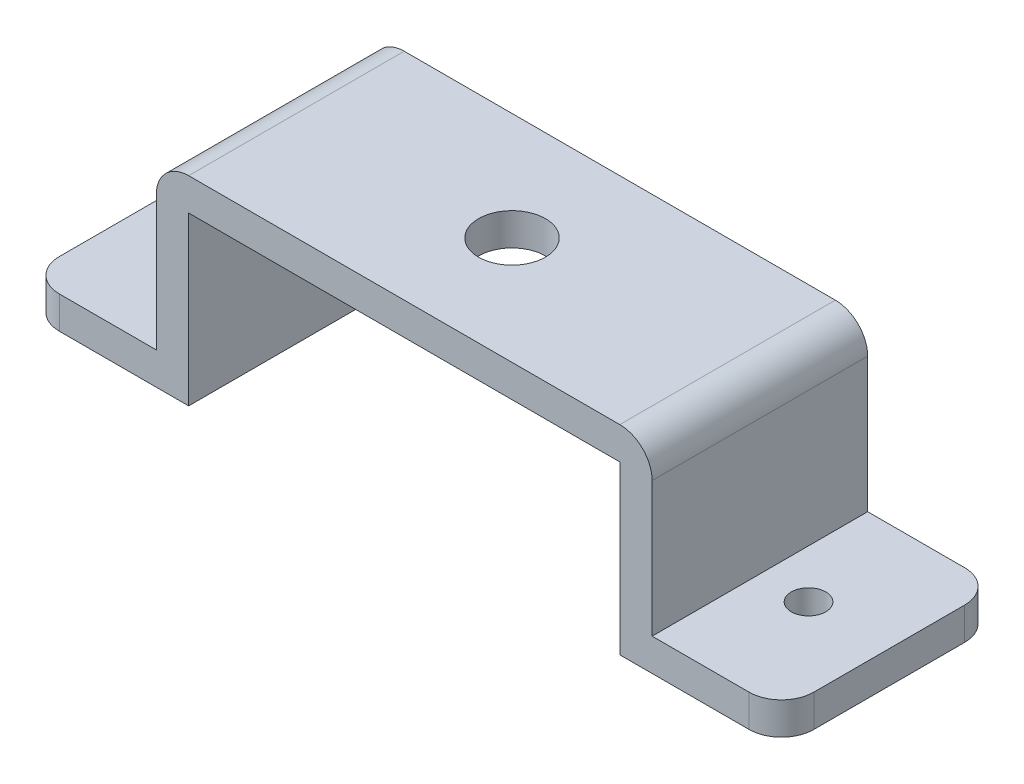
ISO-10303-21;
HEADER;
FILE_DESCRIPTION(('STEP AP214'),'2;1');
FILE_NAME('part.step','',(''),(''),'','','');
FILE_SCHEMA(('AUTOMOTIVE_DESIGN { 1 0 10303 214 1 1 1 1 }'));
ENDSEC;
DATA;
#1=APPLICATION_CONTEXT('core data for automotive mechanical design processes');
#2=APPLICATION_PROTOCOL_DEFINITION('international standard','automotive_design',2000,#1);
#3=PRODUCT_CONTEXT('',#1,'mechanical');
#4=PRODUCT('Part','Part','',(#3));
#5=PRODUCT_RELATED_PRODUCT_CATEGORY('part','',(#4));
#6=PRODUCT_DEFINITION_FORMATION('','',#4);
#7=PRODUCT_DEFINITION_CONTEXT('part definition',#1,'design');
#8=PRODUCT_DEFINITION('design','',#6,#7);
#9=PRODUCT_DEFINITION_SHAPE('','',#8);
#10=(LENGTH_UNIT() NAMED_UNIT(*) SI_UNIT(.MILLI.,.METRE.));
#11=(NAMED_UNIT(*) PLANE_ANGLE_UNIT() SI_UNIT($,.RADIAN.));
#12=(NAMED_UNIT(*) SI_UNIT($,.STERADIAN.) SOLID_ANGLE_UNIT());
#13=UNCERTAINTY_MEASURE_WITH_UNIT(LENGTH_MEASURE(1.E-05),#10,'distance_accuracy_value','');
#14=(GEOMETRIC_REPRESENTATION_CONTEXT(3) GLOBAL_UNCERTAINTY_ASSIGNED_CONTEXT((#13)) GLOBAL_UNIT_ASSIGNED_CONTEXT((#10,
#11,#12)) REPRESENTATION_CONTEXT('',''));
#15=CARTESIAN_POINT('',(0.,0.,0.));
#16=DIRECTION('',(0.,0.,1.));
#17=DIRECTION('',(1.,0.,0.));
#18=AXIS2_PLACEMENT_3D('',#15,#16,#17);
#19=CARTESIAN_POINT('',(0.,15.5,0.));
#20=DIRECTION('',(0.,1.,0.));
#21=DIRECTION('',(0.,0.,1.));
#22=AXIS2_PLACEMENT_3D('',#19,#20,#21);
#23=PLANE('',#22);
#24=CARTESIAN_POINT('',(0.,15.5,0.));
#25=DIRECTION('',(0.,1.,0.));
#26=DIRECTION('',(0.,0.,1.));
#27=AXIS2_PLACEMENT_3D('',#24,#25,#26);
#28=CIRCLE('',#27,3.1);
#29=CARTESIAN_POINT('',(0.,15.5,3.1));
#30=VERTEX_POINT('',#29);
#31=EDGE_CURVE('E455',#30,#30,#28,.T.);
#32=ORIENTED_EDGE('',*,*,#31,.T.);
#33=EDGE_LOOP('',(#32));
#34=FACE_BOUND('',#33,.T.);
#35=DIRECTION('',(0.,0.,1.));
#36=VECTOR('',#35,1.);
#37=CARTESIAN_POINT('',(20.,15.5,10.));
#38=LINE('',#37,#36);
#39=CARTESIAN_POINT('',(20.,15.5,-10.));
#40=VERTEX_POINT('',#39);
#41=CARTESIAN_POINT('',(20.,15.5,10.));
#42=VERTEX_POINT('',#41);
#43=EDGE_CURVE('E169',#40,#42,#38,.T.);
#44=ORIENTED_EDGE('',*,*,#43,.T.);
#45=DIRECTION('',(1.,0.,0.));
#46=VECTOR('',#45,1.);
#47=CARTESIAN_POINT('',(-23.,15.5,10.));
#48=LINE('',#47,#46);
#49=CARTESIAN_POINT('',(-20.,15.5,10.));
#50=VERTEX_POINT('',#49);
#51=EDGE_CURVE('E180',#50,#42,#48,.T.);
#52=ORIENTED_EDGE('',*,*,#51,.F.);
#53=DIRECTION('',(0.,0.,-1.));
#54=VECTOR('',#53,1.);
#55=CARTESIAN_POINT('',(-20.,15.5,-10.));
#56=LINE('',#55,#54);
#57=CARTESIAN_POINT('',(-20.,15.5,-10.));
#58=VERTEX_POINT('',#57);
#59=EDGE_CURVE('E196',#50,#58,#56,.T.);
#60=ORIENTED_EDGE('',*,*,#59,.T.);
#61=DIRECTION('',(-1.,0.,0.));
#62=VECTOR('',#61,1.);
#63=CARTESIAN_POINT('',(-23.,15.5,-10.));
#64=LINE('',#63,#62);
#65=EDGE_CURVE('E186',#40,#58,#64,.T.);
#66=ORIENTED_EDGE('',*,*,#65,.F.);
#67=EDGE_LOOP('',(#44,#52,#60,#66));
#68=FACE_BOUND('',#67,.T.);
#69=ADVANCED_FACE('F45',(#34,#68),#23,.F.);
#70=CARTESIAN_POINT('',(-35.,3.,10.));
#71=DIRECTION('',(1.,0.,0.));
#72=DIRECTION('',(0.,0.,-1.));
#73=AXIS2_PLACEMENT_3D('',#70,#71,#72);
#74=PLANE('',#73);
#75=DIRECTION('',(0.,0.,1.));
#76=VECTOR('',#75,1.);
#77=CARTESIAN_POINT('',(-35.,3.,10.));
#78=LINE('',#77,#76);
#79=CARTESIAN_POINT('',(-35.,3.,-7.));
#80=VERTEX_POINT('',#79);
#81=CARTESIAN_POINT('',(-35.,3.,7.));
#82=VERTEX_POINT('',#81);
#83=EDGE_CURVE('E234',#80,#82,#78,.T.);
#84=ORIENTED_EDGE('',*,*,#83,.F.);
#85=DIRECTION('',(0.,-1.,0.));
#86=VECTOR('',#85,1.);
#87=CARTESIAN_POINT('',(-35.,3.,-7.));
#88=LINE('',#87,#86);
#89=CARTESIAN_POINT('',(-35.,0.,-7.));
#90=VERTEX_POINT('',#89);
#91=EDGE_CURVE('E255',#80,#90,#88,.T.);
#92=ORIENTED_EDGE('',*,*,#91,.T.);
#93=DIRECTION('',(0.,0.,1.));
#94=VECTOR('',#93,1.);
#95=CARTESIAN_POINT('',(-35.,0.,10.));
#96=LINE('',#95,#94);
#97=CARTESIAN_POINT('',(-35.,0.,7.));
#98=VERTEX_POINT('',#97);
#99=EDGE_CURVE('E244',#90,#98,#96,.T.);
#100=ORIENTED_EDGE('',*,*,#99,.T.);
#101=DIRECTION('',(0.,-1.,0.));
#102=VECTOR('',#101,1.);
#103=CARTESIAN_POINT('',(-35.,3.,7.));
#104=LINE('',#103,#102);
#105=EDGE_CURVE('E253',#98,#82,#104,.F.);
#106=ORIENTED_EDGE('',*,*,#105,.T.);
#107=EDGE_LOOP('',(#84,#92,#100,#106));
#108=FACE_BOUND('',#107,.T.);
#109=ADVANCED_FACE('F335',(#108),#74,.F.);
#110=CARTESIAN_POINT('',(-27.4996209045942,24.,-0.0108268287106467));
#111=DIRECTION('',(0.,-1.,0.));
#112=DIRECTION('',(0.,0.,-1.));
#113=AXIS2_PLACEMENT_3D('',#110,#111,#112);
#114=CYLINDRICAL_SURFACE('',#113,1.6);
#115=CARTESIAN_POINT('',(-27.4996209045942,0.,-0.0108268287106467));
#116=DIRECTION('',(0.,-1.,0.));
#117=DIRECTION('',(0.,0.,-1.));
#118=AXIS2_PLACEMENT_3D('',#115,#116,#117);
#119=CIRCLE('',#118,1.6);
#120=CARTESIAN_POINT('',(-27.4996209045942,0.,-1.61082682871064));
#121=VERTEX_POINT('',#120);
#122=EDGE_CURVE('E210',#121,#121,#119,.T.);
#123=ORIENTED_EDGE('',*,*,#122,.T.);
#124=EDGE_LOOP('',(#123));
#125=FACE_BOUND('',#124,.T.);
#126=CARTESIAN_POINT('',(-27.4996209045942,3.,-0.0108268287106467));
#127=DIRECTION('',(0.,-1.,0.));
#128=DIRECTION('',(0.,0.,-1.));
#129=AXIS2_PLACEMENT_3D('',#126,#127,#128);
#130=CIRCLE('',#129,1.6);
#131=CARTESIAN_POINT('',(-27.4996209045942,3.,-1.61082682871064));
#132=VERTEX_POINT('',#131);
#133=EDGE_CURVE('E213',#132,#132,#130,.T.);
#134=ORIENTED_EDGE('',*,*,#133,.F.);
#135=EDGE_LOOP('',(#134));
#136=FACE_BOUND('',#135,.T.);
#137=ADVANCED_FACE('F369',(#125,#136),#114,.F.);
#138=CARTESIAN_POINT('',(-32.,3.,-7.));
#139=DIRECTION('',(0.,-1.,0.));
#140=DIRECTION('',(0.,0.,-1.));
#141=AXIS2_PLACEMENT_3D('',#138,#139,#140);
#142=CYLINDRICAL_SURFACE('',#141,3.);
#143=CARTESIAN_POINT('',(-32.,3.,-7.));
#144=DIRECTION('',(0.,-1.,0.));
#145=DIRECTION('',(0.,0.,-1.));
#146=AXIS2_PLACEMENT_3D('',#143,#144,#145);
#147=CIRCLE('',#146,3.);
#148=CARTESIAN_POINT('',(-32.,3.,-10.));
#149=VERTEX_POINT('',#148);
#150=EDGE_CURVE('E264',#149,#80,#147,.F.);
#151=ORIENTED_EDGE('',*,*,#150,.F.);
#152=DIRECTION('',(0.,-1.,0.));
#153=VECTOR('',#152,1.);
#154=CARTESIAN_POINT('',(-32.,3.,-10.));
#155=LINE('',#154,#153);
#156=CARTESIAN_POINT('',(-32.,0.,-10.));
#157=VERTEX_POINT('',#156);
#158=EDGE_CURVE('E241',#157,#149,#155,.F.);
#159=ORIENTED_EDGE('',*,*,#158,.F.);
#160=CARTESIAN_POINT('',(-32.,0.,-7.));
#161=DIRECTION('',(0.,-1.,0.));
#162=DIRECTION('',(0.,0.,-1.));
#163=AXIS2_PLACEMENT_3D('',#160,#161,#162);
#164=CIRCLE('',#163,3.);
#165=EDGE_CURVE('E260',#90,#157,#164,.T.);
#166=ORIENTED_EDGE('',*,*,#165,.F.);
#167=ORIENTED_EDGE('',*,*,#91,.F.);
#168=EDGE_LOOP('',(#151,#159,#166,#167));
#169=FACE_BOUND('',#168,.T.);
#170=ADVANCED_FACE('F332',(#169),#142,.T.);
#171=CARTESIAN_POINT('',(-32.,3.,7.));
#172=DIRECTION('',(0.,-1.,0.));
#173=DIRECTION('',(0.,0.,-1.));
#174=AXIS2_PLACEMENT_3D('',#171,#172,#173);
#175=CYLINDRICAL_SURFACE('',#174,3.);
#176=CARTESIAN_POINT('',(-32.,3.,7.));
#177=DIRECTION('',(0.,-1.,0.));
#178=DIRECTION('',(0.,0.,-1.));
#179=AXIS2_PLACEMENT_3D('',#176,#177,#178);
#180=CIRCLE('',#179,3.);
#181=CARTESIAN_POINT('',(-32.,3.,10.));
#182=VERTEX_POINT('',#181);
#183=EDGE_CURVE('E262',#82,#182,#180,.F.);
#184=ORIENTED_EDGE('',*,*,#183,.F.);
#185=ORIENTED_EDGE('',*,*,#105,.F.);
#186=CARTESIAN_POINT('',(-32.,0.,7.));
#187=DIRECTION('',(0.,-1.,0.));
#188=DIRECTION('',(0.,0.,-1.));
#189=AXIS2_PLACEMENT_3D('',#186,#187,#188);
#190=CIRCLE('',#189,3.);
#191=CARTESIAN_POINT('',(-32.,0.,10.));
#192=VERTEX_POINT('',#191);
#193=EDGE_CURVE('E258',#192,#98,#190,.T.);
#194=ORIENTED_EDGE('',*,*,#193,.F.);
#195=DIRECTION('',(0.,-1.,0.));
#196=VECTOR('',#195,1.);
#197=CARTESIAN_POINT('',(-32.,3.,10.));
#198=LINE('',#197,#196);
#199=EDGE_CURVE('E250',#182,#192,#198,.T.);
#200=ORIENTED_EDGE('',*,*,#199,.F.);
#201=EDGE_LOOP('',(#184,#185,#194,#200));
#202=FACE_BOUND('',#201,.T.);
#203=ADVANCED_FACE('F344',(#202),#175,.T.);
#204=CARTESIAN_POINT('',(0.,0.,0.));
#205=DIRECTION('',(0.,-1.,0.));
#206=DIRECTION('',(0.,0.,-1.));
#207=AXIS2_PLACEMENT_3D('',#204,#205,#206);
#208=PLANE('',#207);
#209=ORIENTED_EDGE('',*,*,#122,.F.);
#210=EDGE_LOOP('',(#209));
#211=FACE_BOUND('',#210,.T.);
#212=ORIENTED_EDGE('',*,*,#99,.F.);
#213=ORIENTED_EDGE('',*,*,#165,.T.);
#214=DIRECTION('',(-1.,0.,0.));
#215=VECTOR('',#214,1.);
#216=CARTESIAN_POINT('',(-35.,0.,-10.));
#217=LINE('',#216,#215);
#218=CARTESIAN_POINT('',(-20.,0.,-10.));
#219=VERTEX_POINT('',#218);
#220=EDGE_CURVE('E230',#219,#157,#217,.T.);
#221=ORIENTED_EDGE('',*,*,#220,.F.);
#222=DIRECTION('',(0.,0.,1.));
#223=VECTOR('',#222,1.);
#224=CARTESIAN_POINT('',(-20.,0.,-10.));
#225=LINE('',#224,#223);
#226=CARTESIAN_POINT('',(-20.,0.,10.));
#227=VERTEX_POINT('',#226);
#228=EDGE_CURVE('E216',#219,#227,#225,.T.);
#229=ORIENTED_EDGE('',*,*,#228,.T.);
#230=DIRECTION('',(1.,0.,0.));
#231=VECTOR('',#230,1.);
#232=CARTESIAN_POINT('',(-35.,0.,10.));
#233=LINE('',#232,#231);
#234=EDGE_CURVE('E235',#192,#227,#233,.T.);
#235=ORIENTED_EDGE('',*,*,#234,.F.);
#236=ORIENTED_EDGE('',*,*,#193,.T.);
#237=EDGE_LOOP('',(#212,#213,#221,#229,#235,#236));
#238=FACE_BOUND('',#237,.T.);
#239=ADVANCED_FACE('F338',(#211,#238),#208,.T.);
#240=CARTESIAN_POINT('',(0.,3.,0.));
#241=DIRECTION('',(0.,-1.,0.));
#242=DIRECTION('',(0.,0.,-1.));
#243=AXIS2_PLACEMENT_3D('',#240,#241,#242);
#244=PLANE('',#243);
#245=ORIENTED_EDGE('',*,*,#133,.T.);
#246=EDGE_LOOP('',(#245));
#247=FACE_BOUND('',#246,.T.);
#248=DIRECTION('',(-1.,0.,0.));
#249=VECTOR('',#248,1.);
#250=CARTESIAN_POINT('',(-35.,3.,-10.));
#251=LINE('',#250,#249);
#252=CARTESIAN_POINT('',(-23.,3.,-10.));
#253=VERTEX_POINT('',#252);
#254=EDGE_CURVE('E231',#253,#149,#251,.T.);
#255=ORIENTED_EDGE('',*,*,#254,.T.);
#256=ORIENTED_EDGE('',*,*,#150,.T.);
#257=ORIENTED_EDGE('',*,*,#83,.T.);
#258=ORIENTED_EDGE('',*,*,#183,.T.);
#259=DIRECTION('',(1.,0.,0.));
#260=VECTOR('',#259,1.);
#261=CARTESIAN_POINT('',(-35.,3.,10.));
#262=LINE('',#261,#260);
#263=CARTESIAN_POINT('',(-23.,3.,10.));
#264=VERTEX_POINT('',#263);
#265=EDGE_CURVE('E238',#182,#264,#262,.T.);
#266=ORIENTED_EDGE('',*,*,#265,.T.);
#267=DIRECTION('',(0.,0.,1.));
#268=VECTOR('',#267,1.);
#269=CARTESIAN_POINT('',(-23.,3.,-10.));
#270=LINE('',#269,#268);
#271=EDGE_CURVE('E219',#253,#264,#270,.T.);
#272=ORIENTED_EDGE('',*,*,#271,.F.);
#273=EDGE_LOOP('',(#255,#256,#257,#258,#266,#272));
#274=FACE_BOUND('',#273,.T.);
#275=ADVANCED_FACE('F328',(#247,#274),#244,.F.);
#276=CARTESIAN_POINT('',(-20.,21.,-10.));
#277=DIRECTION('',(-1.,0.,0.));
#278=DIRECTION('',(0.,0.,1.));
#279=AXIS2_PLACEMENT_3D('',#276,#277,#278);
#280=PLANE('',#279);
#281=ORIENTED_EDGE('',*,*,#59,.F.);
#282=DIRECTION('',(0.,-1.,0.));
#283=VECTOR('',#282,1.);
#284=CARTESIAN_POINT('',(-20.,21.,10.));
#285=LINE('',#284,#283);
#286=EDGE_CURVE('E228',#50,#227,#285,.T.);
#287=ORIENTED_EDGE('',*,*,#286,.T.);
#288=ORIENTED_EDGE('',*,*,#228,.F.);
#289=DIRECTION('',(0.,-1.,0.));
#290=VECTOR('',#289,1.);
#291=CARTESIAN_POINT('',(-20.,21.,-10.));
#292=LINE('',#291,#290);
#293=EDGE_CURVE('E226',#58,#219,#292,.T.);
#294=ORIENTED_EDGE('',*,*,#293,.F.);
#295=EDGE_LOOP('',(#281,#287,#288,#294));
#296=FACE_BOUND('',#295,.T.);
#297=ADVANCED_FACE('F349',(#296),#280,.F.);
#298=CARTESIAN_POINT('',(-23.,21.,-10.));
#299=DIRECTION('',(1.,0.,0.));
#300=DIRECTION('',(0.,0.,-1.));
#301=AXIS2_PLACEMENT_3D('',#298,#299,#300);
#302=PLANE('',#301);
#303=DIRECTION('',(0.,-1.,0.));
#304=VECTOR('',#303,1.);
#305=CARTESIAN_POINT('',(-23.,21.,9.99999999999999));
#306=LINE('',#305,#304);
#307=CARTESIAN_POINT('',(-23.,15.5,9.99999999999999));
#308=VERTEX_POINT('',#307);
#309=EDGE_CURVE('E222',#308,#264,#306,.T.);
#310=ORIENTED_EDGE('',*,*,#309,.F.);
#311=DIRECTION('',(0.,0.,1.));
#312=VECTOR('',#311,1.);
#313=CARTESIAN_POINT('',(-23.,15.5,-10.));
#314=LINE('',#313,#312);
#315=CARTESIAN_POINT('',(-23.,15.5,-10.));
#316=VERTEX_POINT('',#315);
#317=EDGE_CURVE('E11',#308,#316,#314,.F.);
#318=ORIENTED_EDGE('',*,*,#317,.T.);
#319=DIRECTION('',(0.,-1.,0.));
#320=VECTOR('',#319,1.);
#321=CARTESIAN_POINT('',(-23.,21.,-10.));
#322=LINE('',#321,#320);
#323=EDGE_CURVE('E224',#316,#253,#322,.T.);
#324=ORIENTED_EDGE('',*,*,#323,.T.);
#325=ORIENTED_EDGE('',*,*,#271,.T.);
#326=EDGE_LOOP('',(#310,#318,#324,#325));
#327=FACE_BOUND('',#326,.T.);
#328=ADVANCED_FACE('F322',(#327),#302,.F.);
#329=CARTESIAN_POINT('',(-35.,3.,10.));
#330=DIRECTION('',(0.,0.,-1.));
#331=DIRECTION('',(-1.,0.,0.));
#332=AXIS2_PLACEMENT_3D('',#329,#330,#331);
#333=PLANE('',#332);
#334=DIRECTION('',(0.,-1.,0.));
#335=VECTOR('',#334,1.);
#336=CARTESIAN_POINT('',(23.,18.5,10.));
#337=LINE('',#336,#335);
#338=CARTESIAN_POINT('',(23.,15.5,10.));
#339=VERTEX_POINT('',#338);
#340=CARTESIAN_POINT('',(23.,3.,10.));
#341=VERTEX_POINT('',#340);
#342=EDGE_CURVE('E207',#339,#341,#337,.T.);
#343=ORIENTED_EDGE('',*,*,#342,.F.);
#344=CARTESIAN_POINT('',(20.,15.5,10.));
#345=DIRECTION('',(0.,0.,-1.));
#346=DIRECTION('',(-1.,0.,0.));
#347=AXIS2_PLACEMENT_3D('',#344,#345,#346);
#348=CIRCLE('',#347,3.);
#349=CARTESIAN_POINT('',(20.,18.5,10.));
#350=VERTEX_POINT('',#349);
#351=EDGE_CURVE('E53',#339,#350,#348,.F.);
#352=ORIENTED_EDGE('',*,*,#351,.T.);
#353=DIRECTION('',(1.,0.,0.));
#354=VECTOR('',#353,1.);
#355=CARTESIAN_POINT('',(-23.,18.5,10.));
#356=LINE('',#355,#354);
#357=CARTESIAN_POINT('',(-20.,18.5,10.));
#358=VERTEX_POINT('',#357);
#359=EDGE_CURVE('E197',#358,#350,#356,.T.);
#360=ORIENTED_EDGE('',*,*,#359,.F.);
#361=CARTESIAN_POINT('',(-20.,15.5,10.));
#362=DIRECTION('',(0.,0.,-1.));
#363=DIRECTION('',(-1.,0.,0.));
#364=AXIS2_PLACEMENT_3D('',#361,#362,#363);
#365=CIRCLE('',#364,3.);
#366=EDGE_CURVE('E60',#358,#308,#365,.F.);
#367=ORIENTED_EDGE('',*,*,#366,.T.);
#368=ORIENTED_EDGE('',*,*,#309,.T.);
#369=ORIENTED_EDGE('',*,*,#265,.F.);
#370=ORIENTED_EDGE('',*,*,#199,.T.);
#371=ORIENTED_EDGE('',*,*,#234,.T.);
#372=ORIENTED_EDGE('',*,*,#286,.F.);
#373=ORIENTED_EDGE('',*,*,#51,.T.);
#374=DIRECTION('',(0.,-1.,0.));
#375=VECTOR('',#374,1.);
#376=CARTESIAN_POINT('',(20.,21.,10.));
#377=LINE('',#376,#375);
#378=CARTESIAN_POINT('',(20.,0.,10.));
#379=VERTEX_POINT('',#378);
#380=EDGE_CURVE('E175',#42,#379,#377,.T.);
#381=ORIENTED_EDGE('',*,*,#380,.T.);
#382=DIRECTION('',(1.,0.,0.));
#383=VECTOR('',#382,1.);
#384=CARTESIAN_POINT('',(-35.,0.,10.));
#385=LINE('',#384,#383);
#386=CARTESIAN_POINT('',(32.,0.,10.));
#387=VERTEX_POINT('',#386);
#388=EDGE_CURVE('E296',#379,#387,#385,.T.);
#389=ORIENTED_EDGE('',*,*,#388,.T.);
#390=DIRECTION('',(0.,-1.,0.));
#391=VECTOR('',#390,1.);
#392=CARTESIAN_POINT('',(32.,3.,10.));
#393=LINE('',#392,#391);
#394=CARTESIAN_POINT('',(32.,3.,10.));
#395=VERTEX_POINT('',#394);
#396=EDGE_CURVE('E294',#387,#395,#393,.F.);
#397=ORIENTED_EDGE('',*,*,#396,.T.);
#398=DIRECTION('',(1.,0.,0.));
#399=VECTOR('',#398,1.);
#400=CARTESIAN_POINT('',(-35.,3.,10.));
#401=LINE('',#400,#399);
#402=EDGE_CURVE('E308',#341,#395,#401,.T.);
#403=ORIENTED_EDGE('',*,*,#402,.F.);
#404=EDGE_LOOP('',(#343,#352,#360,#367,#368,#369,#370,#371,#372,#373,#381,#389,#397,#403));
#405=FACE_BOUND('',#404,.T.);
#406=ADVANCED_FACE('F278',(#405),#333,.F.);
#407=CARTESIAN_POINT('',(-35.,3.,-10.));
#408=DIRECTION('',(0.,0.,1.));
#409=DIRECTION('',(1.,0.,0.));
#410=AXIS2_PLACEMENT_3D('',#407,#408,#409);
#411=PLANE('',#410);
#412=DIRECTION('',(-1.,0.,0.));
#413=VECTOR('',#412,1.);
#414=CARTESIAN_POINT('',(-23.,18.5,-10.));
#415=LINE('',#414,#413);
#416=CARTESIAN_POINT('',(20.,18.5,-10.));
#417=VERTEX_POINT('',#416);
#418=CARTESIAN_POINT('',(-20.,18.5,-10.));
#419=VERTEX_POINT('',#418);
#420=EDGE_CURVE('E200',#417,#419,#415,.T.);
#421=ORIENTED_EDGE('',*,*,#420,.F.);
#422=CARTESIAN_POINT('',(20.,15.5,-10.));
#423=DIRECTION('',(0.,0.,1.));
#424=DIRECTION('',(1.,0.,0.));
#425=AXIS2_PLACEMENT_3D('',#422,#423,#424);
#426=CIRCLE('',#425,3.);
#427=CARTESIAN_POINT('',(23.,15.5,-10.));
#428=VERTEX_POINT('',#427);
#429=EDGE_CURVE('E274',#417,#428,#426,.F.);
#430=ORIENTED_EDGE('',*,*,#429,.T.);
#431=DIRECTION('',(0.,-1.,0.));
#432=VECTOR('',#431,1.);
#433=CARTESIAN_POINT('',(23.,18.5,-10.));
#434=LINE('',#433,#432);
#435=CARTESIAN_POINT('',(23.,3.,-10.));
#436=VERTEX_POINT('',#435);
#437=EDGE_CURVE('E205',#428,#436,#434,.T.);
#438=ORIENTED_EDGE('',*,*,#437,.T.);
#439=DIRECTION('',(-1.,0.,0.));
#440=VECTOR('',#439,1.);
#441=CARTESIAN_POINT('',(-35.,3.,-10.));
#442=LINE('',#441,#440);
#443=CARTESIAN_POINT('',(32.,3.,-10.));
#444=VERTEX_POINT('',#443);
#445=EDGE_CURVE('E311',#444,#436,#442,.T.);
#446=ORIENTED_EDGE('',*,*,#445,.F.);
#447=DIRECTION('',(0.,-1.,0.));
#448=VECTOR('',#447,1.);
#449=CARTESIAN_POINT('',(32.,3.,-10.));
#450=LINE('',#449,#448);
#451=CARTESIAN_POINT('',(32.,0.,-10.));
#452=VERTEX_POINT('',#451);
#453=EDGE_CURVE('E316',#444,#452,#450,.T.);
#454=ORIENTED_EDGE('',*,*,#453,.T.);
#455=DIRECTION('',(-1.,0.,0.));
#456=VECTOR('',#455,1.);
#457=CARTESIAN_POINT('',(-35.,0.,-10.));
#458=LINE('',#457,#456);
#459=CARTESIAN_POINT('',(20.,0.,-10.));
#460=VERTEX_POINT('',#459);
#461=EDGE_CURVE('E190',#452,#460,#458,.T.);
#462=ORIENTED_EDGE('',*,*,#461,.T.);
#463=DIRECTION('',(0.,-1.,0.));
#464=VECTOR('',#463,1.);
#465=CARTESIAN_POINT('',(20.,21.,-10.));
#466=LINE('',#465,#464);
#467=EDGE_CURVE('E173',#40,#460,#466,.T.);
#468=ORIENTED_EDGE('',*,*,#467,.F.);
#469=ORIENTED_EDGE('',*,*,#65,.T.);
#470=ORIENTED_EDGE('',*,*,#293,.T.);
#471=ORIENTED_EDGE('',*,*,#220,.T.);
#472=ORIENTED_EDGE('',*,*,#158,.T.);
#473=ORIENTED_EDGE('',*,*,#254,.F.);
#474=ORIENTED_EDGE('',*,*,#323,.F.);
#475=CARTESIAN_POINT('',(-20.,15.5,-10.));
#476=DIRECTION('',(0.,0.,1.));
#477=DIRECTION('',(1.,0.,0.));
#478=AXIS2_PLACEMENT_3D('',#475,#476,#477);
#479=CIRCLE('',#478,3.);
#480=EDGE_CURVE('E272',#316,#419,#479,.F.);
#481=ORIENTED_EDGE('',*,*,#480,.T.);
#482=EDGE_LOOP('',(#421,#430,#438,#446,#454,#462,#468,#469,#470,#471,#472,#473,#474,#481));
#483=FACE_BOUND('',#482,.T.);
#484=ADVANCED_FACE('F185',(#483),#411,.F.);
#485=CARTESIAN_POINT('',(23.,18.5,-10.));
#486=DIRECTION('',(-1.,0.,0.));
#487=DIRECTION('',(0.,0.,1.));
#488=AXIS2_PLACEMENT_3D('',#485,#486,#487);
#489=PLANE('',#488);
#490=ORIENTED_EDGE('',*,*,#437,.F.);
#491=DIRECTION('',(0.,0.,-1.));
#492=VECTOR('',#491,1.);
#493=CARTESIAN_POINT('',(23.,15.5,10.));
#494=LINE('',#493,#492);
#495=EDGE_CURVE('E68',#428,#339,#494,.F.);
#496=ORIENTED_EDGE('',*,*,#495,.T.);
#497=ORIENTED_EDGE('',*,*,#342,.T.);
#498=DIRECTION('',(0.,0.,-1.));
#499=VECTOR('',#498,1.);
#500=CARTESIAN_POINT('',(23.,3.,-10.));
#501=LINE('',#500,#499);
#502=EDGE_CURVE('E193',#341,#436,#501,.T.);
#503=ORIENTED_EDGE('',*,*,#502,.T.);
#504=EDGE_LOOP('',(#490,#496,#497,#503));
#505=FACE_BOUND('',#504,.T.);
#506=ADVANCED_FACE('F290',(#505),#489,.F.);
#507=CARTESIAN_POINT('',(0.,18.5,0.));
#508=DIRECTION('',(0.,1.,0.));
#509=DIRECTION('',(0.,0.,1.));
#510=AXIS2_PLACEMENT_3D('',#507,#508,#509);
#511=PLANE('',#510);
#512=CARTESIAN_POINT('',(0.,18.5,0.));
#513=DIRECTION('',(0.,1.,0.));
#514=DIRECTION('',(0.,0.,1.));
#515=AXIS2_PLACEMENT_3D('',#512,#513,#514);
#516=CIRCLE('',#515,3.1);
#517=CARTESIAN_POINT('',(0.,18.5,3.1));
#518=VERTEX_POINT('',#517);
#519=EDGE_CURVE('E461',#518,#518,#516,.T.);
#520=ORIENTED_EDGE('',*,*,#519,.F.);
#521=EDGE_LOOP('',(#520));
#522=FACE_BOUND('',#521,.T.);
#523=ORIENTED_EDGE('',*,*,#359,.T.);
#524=DIRECTION('',(0.,0.,-1.));
#525=VECTOR('',#524,1.);
#526=CARTESIAN_POINT('',(20.,18.5,-10.));
#527=LINE('',#526,#525);
#528=EDGE_CURVE('E269',#350,#417,#527,.T.);
#529=ORIENTED_EDGE('',*,*,#528,.T.);
#530=ORIENTED_EDGE('',*,*,#420,.T.);
#531=DIRECTION('',(0.,0.,1.));
#532=VECTOR('',#531,1.);
#533=CARTESIAN_POINT('',(-20.,18.5,10.));
#534=LINE('',#533,#532);
#535=EDGE_CURVE('E266',#419,#358,#534,.T.);
#536=ORIENTED_EDGE('',*,*,#535,.T.);
#537=EDGE_LOOP('',(#523,#529,#530,#536));
#538=FACE_BOUND('',#537,.T.);
#539=ADVANCED_FACE('F283',(#522,#538),#511,.T.);
#540=CARTESIAN_POINT('',(20.,21.,10.));
#541=DIRECTION('',(1.,0.,0.));
#542=DIRECTION('',(0.,0.,-1.));
#543=AXIS2_PLACEMENT_3D('',#540,#541,#542);
#544=PLANE('',#543);
#545=ORIENTED_EDGE('',*,*,#43,.F.);
#546=ORIENTED_EDGE('',*,*,#467,.T.);
#547=DIRECTION('',(0.,0.,1.));
#548=VECTOR('',#547,1.);
#549=CARTESIAN_POINT('',(20.,0.,-10.));
#550=LINE('',#549,#548);
#551=EDGE_CURVE('E192',#460,#379,#550,.T.);
#552=ORIENTED_EDGE('',*,*,#551,.T.);
#553=ORIENTED_EDGE('',*,*,#380,.F.);
#554=EDGE_LOOP('',(#545,#546,#552,#553));
#555=FACE_BOUND('',#554,.T.);
#556=ADVANCED_FACE('F171',(#555),#544,.F.);
#557=CARTESIAN_POINT('',(0.,0.,0.));
#558=DIRECTION('',(0.,-1.,0.));
#559=DIRECTION('',(0.,0.,-1.));
#560=AXIS2_PLACEMENT_3D('',#557,#558,#559);
#561=PLANE('',#560);
#562=CARTESIAN_POINT('',(27.5003790954058,0.,-0.0108268287104547));
#563=DIRECTION('',(0.,-1.,0.));
#564=DIRECTION('',(0.,0.,-1.));
#565=AXIS2_PLACEMENT_3D('',#562,#563,#564);
#566=CIRCLE('',#565,1.6);
#567=CARTESIAN_POINT('',(27.5003790954058,0.,-1.61082682871045));
#568=VERTEX_POINT('',#567);
#569=EDGE_CURVE('E181',#568,#568,#566,.T.);
#570=ORIENTED_EDGE('',*,*,#569,.F.);
#571=EDGE_LOOP('',(#570));
#572=FACE_BOUND('',#571,.T.);
#573=ORIENTED_EDGE('',*,*,#461,.F.);
#574=CARTESIAN_POINT('',(32.,0.,-7.));
#575=DIRECTION('',(0.,-1.,0.));
#576=DIRECTION('',(0.,0.,-1.));
#577=AXIS2_PLACEMENT_3D('',#574,#575,#576);
#578=CIRCLE('',#577,3.);
#579=CARTESIAN_POINT('',(35.,0.,-7.));
#580=VERTEX_POINT('',#579);
#581=EDGE_CURVE('E304',#452,#580,#578,.T.);
#582=ORIENTED_EDGE('',*,*,#581,.T.);
#583=DIRECTION('',(0.,0.,-1.));
#584=VECTOR('',#583,1.);
#585=CARTESIAN_POINT('',(35.,0.,10.));
#586=LINE('',#585,#584);
#587=CARTESIAN_POINT('',(35.,0.,7.));
#588=VERTEX_POINT('',#587);
#589=EDGE_CURVE('E449',#588,#580,#586,.T.);
#590=ORIENTED_EDGE('',*,*,#589,.F.);
#591=CARTESIAN_POINT('',(32.,0.,7.));
#592=DIRECTION('',(0.,-1.,0.));
#593=DIRECTION('',(0.,0.,-1.));
#594=AXIS2_PLACEMENT_3D('',#591,#592,#593);
#595=CIRCLE('',#594,3.);
#596=EDGE_CURVE('E453',#588,#387,#595,.T.);
#597=ORIENTED_EDGE('',*,*,#596,.T.);
#598=ORIENTED_EDGE('',*,*,#388,.F.);
#599=ORIENTED_EDGE('',*,*,#551,.F.);
#600=EDGE_LOOP('',(#573,#582,#590,#597,#598,#599));
#601=FACE_BOUND('',#600,.T.);
#602=ADVANCED_FACE('F425',(#572,#601),#561,.T.);
#603=CARTESIAN_POINT('',(0.,3.,0.));
#604=DIRECTION('',(0.,-1.,0.));
#605=DIRECTION('',(0.,0.,-1.));
#606=AXIS2_PLACEMENT_3D('',#603,#604,#605);
#607=PLANE('',#606);
#608=CARTESIAN_POINT('',(27.5003790954058,3.,-0.0108268287104547));
#609=DIRECTION('',(0.,-1.,0.));
#610=DIRECTION('',(0.,0.,-1.));
#611=AXIS2_PLACEMENT_3D('',#608,#609,#610);
#612=CIRCLE('',#611,1.6);
#613=CARTESIAN_POINT('',(27.5003790954058,3.,-1.61082682871045));
#614=VERTEX_POINT('',#613);
#615=EDGE_CURVE('E435',#614,#614,#612,.T.);
#616=ORIENTED_EDGE('',*,*,#615,.T.);
#617=EDGE_LOOP('',(#616));
#618=FACE_BOUND('',#617,.T.);
#619=DIRECTION('',(0.,0.,-1.));
#620=VECTOR('',#619,1.);
#621=CARTESIAN_POINT('',(35.,3.,10.));
#622=LINE('',#621,#620);
#623=CARTESIAN_POINT('',(35.,3.,7.));
#624=VERTEX_POINT('',#623);
#625=CARTESIAN_POINT('',(35.,3.,-7.));
#626=VERTEX_POINT('',#625);
#627=EDGE_CURVE('E300',#624,#626,#622,.T.);
#628=ORIENTED_EDGE('',*,*,#627,.T.);
#629=CARTESIAN_POINT('',(32.,3.,-7.));
#630=DIRECTION('',(0.,-1.,0.));
#631=DIRECTION('',(0.,0.,-1.));
#632=AXIS2_PLACEMENT_3D('',#629,#630,#631);
#633=CIRCLE('',#632,3.);
#634=EDGE_CURVE('E313',#626,#444,#633,.F.);
#635=ORIENTED_EDGE('',*,*,#634,.T.);
#636=ORIENTED_EDGE('',*,*,#445,.T.);
#637=ORIENTED_EDGE('',*,*,#502,.F.);
#638=ORIENTED_EDGE('',*,*,#402,.T.);
#639=CARTESIAN_POINT('',(32.,3.,7.));
#640=DIRECTION('',(0.,-1.,0.));
#641=DIRECTION('',(0.,0.,-1.));
#642=AXIS2_PLACEMENT_3D('',#639,#640,#641);
#643=CIRCLE('',#642,3.);
#644=EDGE_CURVE('E310',#395,#624,#643,.F.);
#645=ORIENTED_EDGE('',*,*,#644,.T.);
#646=EDGE_LOOP('',(#628,#635,#636,#637,#638,#645));
#647=FACE_BOUND('',#646,.T.);
#648=ADVANCED_FACE('F423',(#618,#647),#607,.F.);
#649=CARTESIAN_POINT('',(35.,3.,10.));
#650=DIRECTION('',(-1.,0.,0.));
#651=DIRECTION('',(0.,0.,1.));
#652=AXIS2_PLACEMENT_3D('',#649,#650,#651);
#653=PLANE('',#652);
#654=ORIENTED_EDGE('',*,*,#589,.T.);
#655=DIRECTION('',(0.,-1.,0.));
#656=VECTOR('',#655,1.);
#657=CARTESIAN_POINT('',(35.,3.,-7.));
#658=LINE('',#657,#656);
#659=EDGE_CURVE('E444',#580,#626,#658,.F.);
#660=ORIENTED_EDGE('',*,*,#659,.T.);
#661=ORIENTED_EDGE('',*,*,#627,.F.);
#662=DIRECTION('',(0.,-1.,0.));
#663=VECTOR('',#662,1.);
#664=CARTESIAN_POINT('',(35.,3.,7.));
#665=LINE('',#664,#663);
#666=EDGE_CURVE('E306',#624,#588,#665,.T.);
#667=ORIENTED_EDGE('',*,*,#666,.T.);
#668=EDGE_LOOP('',(#654,#660,#661,#667));
#669=FACE_BOUND('',#668,.T.);
#670=ADVANCED_FACE('F419',(#669),#653,.F.);
#671=CARTESIAN_POINT('',(32.,3.,-7.));
#672=DIRECTION('',(0.,-1.,0.));
#673=DIRECTION('',(0.,0.,-1.));
#674=AXIS2_PLACEMENT_3D('',#671,#672,#673);
#675=CYLINDRICAL_SURFACE('',#674,3.);
#676=ORIENTED_EDGE('',*,*,#634,.F.);
#677=ORIENTED_EDGE('',*,*,#659,.F.);
#678=ORIENTED_EDGE('',*,*,#581,.F.);
#679=ORIENTED_EDGE('',*,*,#453,.F.);
#680=EDGE_LOOP('',(#676,#677,#678,#679));
#681=FACE_BOUND('',#680,.T.);
#682=ADVANCED_FACE('F415',(#681),#675,.T.);
#683=CARTESIAN_POINT('',(32.,3.,7.));
#684=DIRECTION('',(0.,-1.,0.));
#685=DIRECTION('',(0.,0.,-1.));
#686=AXIS2_PLACEMENT_3D('',#683,#684,#685);
#687=CYLINDRICAL_SURFACE('',#686,3.);
#688=ORIENTED_EDGE('',*,*,#644,.F.);
#689=ORIENTED_EDGE('',*,*,#396,.F.);
#690=ORIENTED_EDGE('',*,*,#596,.F.);
#691=ORIENTED_EDGE('',*,*,#666,.F.);
#692=EDGE_LOOP('',(#688,#689,#690,#691));
#693=FACE_BOUND('',#692,.T.);
#694=ADVANCED_FACE('F407',(#693),#687,.T.);
#695=CARTESIAN_POINT('',(27.5003790954058,24.,-0.0108268287104547));
#696=DIRECTION('',(0.,-1.,0.));
#697=DIRECTION('',(0.,0.,-1.));
#698=AXIS2_PLACEMENT_3D('',#695,#696,#697);
#699=CYLINDRICAL_SURFACE('',#698,1.6);
#700=ORIENTED_EDGE('',*,*,#569,.T.);
#701=EDGE_LOOP('',(#700));
#702=FACE_BOUND('',#701,.T.);
#703=ORIENTED_EDGE('',*,*,#615,.F.);
#704=EDGE_LOOP('',(#703));
#705=FACE_BOUND('',#704,.T.);
#706=ADVANCED_FACE('F402',(#702,#705),#699,.F.);
#707=CARTESIAN_POINT('',(0.,15.5,0.));
#708=DIRECTION('',(0.,1.,0.));
#709=DIRECTION('',(0.,0.,1.));
#710=AXIS2_PLACEMENT_3D('',#707,#708,#709);
#711=CYLINDRICAL_SURFACE('',#710,3.1);
#712=ORIENTED_EDGE('',*,*,#31,.F.);
#713=EDGE_LOOP('',(#712));
#714=FACE_BOUND('',#713,.T.);
#715=ORIENTED_EDGE('',*,*,#519,.T.);
#716=EDGE_LOOP('',(#715));
#717=FACE_BOUND('',#716,.T.);
#718=ADVANCED_FACE('F397',(#714,#717),#711,.F.);
#719=CARTESIAN_POINT('',(20.,15.5,0.));
#720=DIRECTION('',(0.,0.,1.));
#721=DIRECTION('',(1.,0.,0.));
#722=AXIS2_PLACEMENT_3D('',#719,#720,#721);
#723=CYLINDRICAL_SURFACE('',#722,3.);
#724=ORIENTED_EDGE('',*,*,#351,.F.);
#725=ORIENTED_EDGE('',*,*,#495,.F.);
#726=ORIENTED_EDGE('',*,*,#429,.F.);
#727=ORIENTED_EDGE('',*,*,#528,.F.);
#728=EDGE_LOOP('',(#724,#725,#726,#727));
#729=FACE_BOUND('',#728,.T.);
#730=ADVANCED_FACE('F286',(#729),#723,.T.);
#731=CARTESIAN_POINT('',(-20.,15.5,0.));
#732=DIRECTION('',(0.,0.,-1.));
#733=DIRECTION('',(-1.,0.,0.));
#734=AXIS2_PLACEMENT_3D('',#731,#732,#733);
#735=CYLINDRICAL_SURFACE('',#734,3.);
#736=ORIENTED_EDGE('',*,*,#480,.F.);
#737=ORIENTED_EDGE('',*,*,#317,.F.);
#738=ORIENTED_EDGE('',*,*,#366,.F.);
#739=ORIENTED_EDGE('',*,*,#535,.F.);
#740=EDGE_LOOP('',(#736,#737,#738,#739));
#741=FACE_BOUND('',#740,.T.);
#742=ADVANCED_FACE('F47',(#741),#735,.T.);
#743=CLOSED_SHELL('',(#69,#109,#137,#170,#203,#239,#275,#297,#328,#406,#484,#506,#539,#556,#602,
#648,#670,#682,#694,#706,#718,#730,#742));
#744=MANIFOLD_SOLID_BREP('B2',#743);
#745=ADVANCED_BREP_SHAPE_REPRESENTATION('',(#18,#744),#14);
#746=SHAPE_DEFINITION_REPRESENTATION(#9,#745);
ENDSEC;
END-ISO-10303-21;
